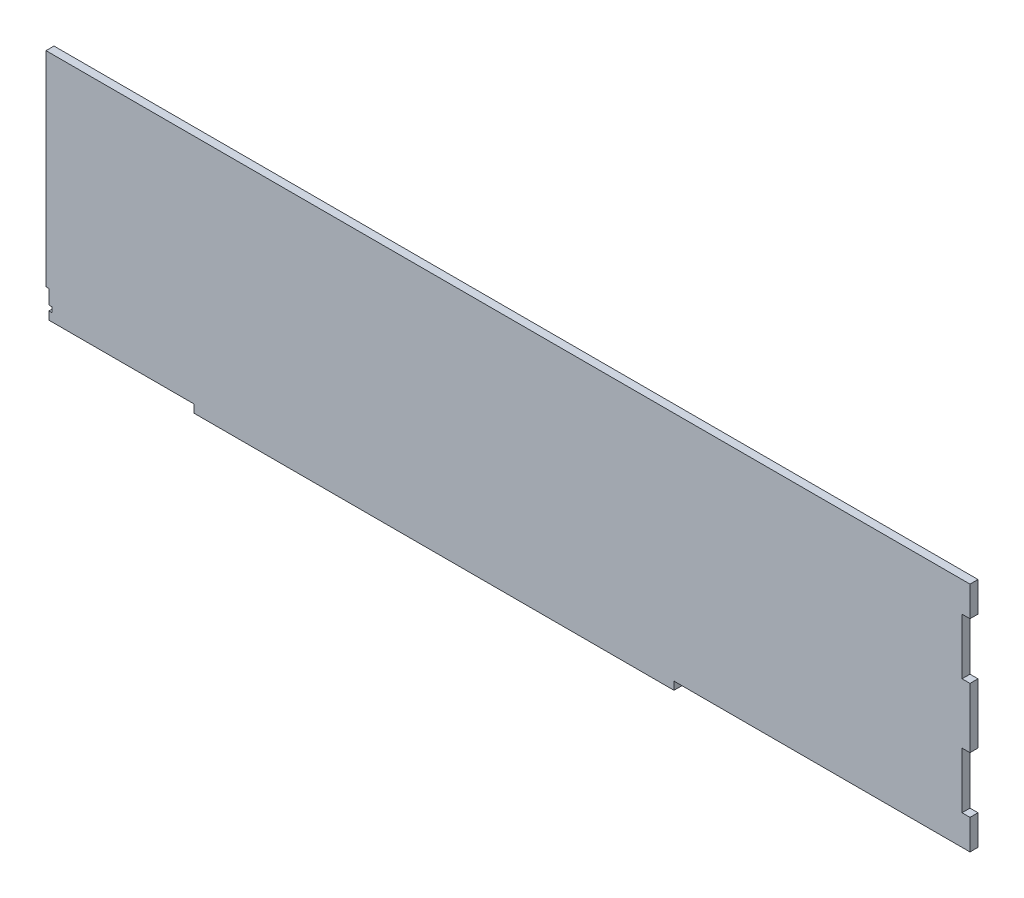
ISO-10303-21;
HEADER;
FILE_DESCRIPTION(('STEP AP214'),'2;1');
FILE_NAME('part.step','',(''),(''),'','','');
FILE_SCHEMA(('AUTOMOTIVE_DESIGN { 1 0 10303 214 1 1 1 1 }'));
ENDSEC;
DATA;
#1=APPLICATION_CONTEXT('core data for automotive mechanical design processes');
#2=APPLICATION_PROTOCOL_DEFINITION('international standard','automotive_design',2000,#1);
#3=PRODUCT_CONTEXT('',#1,'mechanical');
#4=PRODUCT('Part','Part','',(#3));
#5=PRODUCT_RELATED_PRODUCT_CATEGORY('part','',(#4));
#6=PRODUCT_DEFINITION_FORMATION('','',#4);
#7=PRODUCT_DEFINITION_CONTEXT('part definition',#1,'design');
#8=PRODUCT_DEFINITION('design','',#6,#7);
#9=PRODUCT_DEFINITION_SHAPE('','',#8);
#10=(LENGTH_UNIT() NAMED_UNIT(*) SI_UNIT(.MILLI.,.METRE.));
#11=(NAMED_UNIT(*) PLANE_ANGLE_UNIT() SI_UNIT($,.RADIAN.));
#12=(NAMED_UNIT(*) SI_UNIT($,.STERADIAN.) SOLID_ANGLE_UNIT());
#13=UNCERTAINTY_MEASURE_WITH_UNIT(LENGTH_MEASURE(1.E-05),#10,'distance_accuracy_value','');
#14=(GEOMETRIC_REPRESENTATION_CONTEXT(3) GLOBAL_UNCERTAINTY_ASSIGNED_CONTEXT((#13)) GLOBAL_UNIT_ASSIGNED_CONTEXT((#10,
#11,#12)) REPRESENTATION_CONTEXT('',''));
#15=CARTESIAN_POINT('',(0.,0.,0.));
#16=DIRECTION('',(0.,0.,1.));
#17=DIRECTION('',(1.,0.,0.));
#18=AXIS2_PLACEMENT_3D('',#15,#16,#17);
#19=CARTESIAN_POINT('',(1640.,0.,5.));
#20=DIRECTION('',(-1.,0.,0.));
#21=DIRECTION('',(0.,0.,1.));
#22=AXIS2_PLACEMENT_3D('',#19,#20,#21);
#23=PLANE('',#22);
#24=DIRECTION('',(0.,0.,1.));
#25=VECTOR('',#24,1.);
#26=CARTESIAN_POINT('',(1640.,91.25,0.));
#27=LINE('',#26,#25);
#28=CARTESIAN_POINT('',(1640.,91.25,0.));
#29=VERTEX_POINT('',#28);
#30=CARTESIAN_POINT('',(1640.,91.25,5.));
#31=VERTEX_POINT('',#30);
#32=EDGE_CURVE('E309',#29,#31,#27,.T.);
#33=ORIENTED_EDGE('',*,*,#32,.T.);
#34=DIRECTION('',(0.,1.,0.));
#35=VECTOR('',#34,1.);
#36=CARTESIAN_POINT('',(1640.,0.,5.));
#37=LINE('',#36,#35);
#38=CARTESIAN_POINT('',(1640.,53.75,5.));
#39=VERTEX_POINT('',#38);
#40=EDGE_CURVE('E210',#39,#31,#37,.T.);
#41=ORIENTED_EDGE('',*,*,#40,.F.);
#42=DIRECTION('',(0.,0.,1.));
#43=VECTOR('',#42,1.);
#44=CARTESIAN_POINT('',(1640.,53.75,0.));
#45=LINE('',#44,#43);
#46=CARTESIAN_POINT('',(1640.,53.75,0.));
#47=VERTEX_POINT('',#46);
#48=EDGE_CURVE('E337',#47,#39,#45,.T.);
#49=ORIENTED_EDGE('',*,*,#48,.F.);
#50=DIRECTION('',(0.,1.,0.));
#51=VECTOR('',#50,1.);
#52=CARTESIAN_POINT('',(1640.,0.,0.));
#53=LINE('',#52,#51);
#54=EDGE_CURVE('E231',#47,#29,#53,.T.);
#55=ORIENTED_EDGE('',*,*,#54,.T.);
#56=EDGE_LOOP('',(#33,#41,#49,#55));
#57=FACE_BOUND('',#56,.T.);
#58=ADVANCED_FACE('F35',(#57),#23,.F.);
#59=DIRECTION('',(0.,0.,1.));
#60=VECTOR('',#59,1.);
#61=CARTESIAN_POINT('',(1640.,18.75,0.));
#62=LINE('',#61,#60);
#63=CARTESIAN_POINT('',(1640.,18.75,0.));
#64=VERTEX_POINT('',#63);
#65=CARTESIAN_POINT('',(1640.,18.75,5.));
#66=VERTEX_POINT('',#65);
#67=EDGE_CURVE('E217',#64,#66,#62,.T.);
#68=ORIENTED_EDGE('',*,*,#67,.T.);
#69=CARTESIAN_POINT('',(1640.,0.,5.));
#70=VERTEX_POINT('',#69);
#71=EDGE_CURVE('E205',#70,#66,#37,.T.);
#72=ORIENTED_EDGE('',*,*,#71,.F.);
#73=DIRECTION('',(0.,0.,-1.));
#74=VECTOR('',#73,1.);
#75=CARTESIAN_POINT('',(1640.,0.,5.));
#76=LINE('',#75,#74);
#77=CARTESIAN_POINT('',(1640.,0.,0.));
#78=VERTEX_POINT('',#77);
#79=EDGE_CURVE('E207',#70,#78,#76,.T.);
#80=ORIENTED_EDGE('',*,*,#79,.T.);
#81=EDGE_CURVE('E228',#78,#64,#53,.T.);
#82=ORIENTED_EDGE('',*,*,#81,.T.);
#83=EDGE_LOOP('',(#68,#72,#80,#82));
#84=FACE_BOUND('',#83,.T.);
#85=ADVANCED_FACE('F384',(#84),#23,.F.);
#86=CARTESIAN_POINT('',(0.,0.,5.));
#87=DIRECTION('',(0.,0.,1.));
#88=DIRECTION('',(1.,0.,0.));
#89=AXIS2_PLACEMENT_3D('',#86,#87,#88);
#90=PLANE('',#89);
#91=DIRECTION('',(0.,1.,0.));
#92=VECTOR('',#91,1.);
#93=CARTESIAN_POINT('',(1062.5,17.2,5.));
#94=LINE('',#93,#92);
#95=CARTESIAN_POINT('',(1062.5,17.2,5.));
#96=VERTEX_POINT('',#95);
#97=CARTESIAN_POINT('',(1062.5,145.,5.));
#98=VERTEX_POINT('',#97);
#99=EDGE_CURVE('E182',#96,#98,#94,.T.);
#100=ORIENTED_EDGE('',*,*,#99,.F.);
#101=DIRECTION('',(-1.,0.,0.));
#102=VECTOR('',#101,1.);
#103=CARTESIAN_POINT('',(1064.3,17.2,5.));
#104=LINE('',#103,#102);
#105=CARTESIAN_POINT('',(1064.3,17.2,5.));
#106=VERTEX_POINT('',#105);
#107=EDGE_CURVE('E294',#106,#96,#104,.T.);
#108=ORIENTED_EDGE('',*,*,#107,.F.);
#109=DIRECTION('',(0.,1.,0.));
#110=VECTOR('',#109,1.);
#111=CARTESIAN_POINT('',(1064.3,8.2,5.));
#112=LINE('',#111,#110);
#113=CARTESIAN_POINT('',(1064.3,8.2,5.));
#114=VERTEX_POINT('',#113);
#115=EDGE_CURVE('E296',#114,#106,#112,.T.);
#116=ORIENTED_EDGE('',*,*,#115,.F.);
#117=DIRECTION('',(-1.,0.,0.));
#118=VECTOR('',#117,1.);
#119=CARTESIAN_POINT('',(1066.1,8.2,5.));
#120=LINE('',#119,#118);
#121=CARTESIAN_POINT('',(1066.1,8.2,5.));
#122=VERTEX_POINT('',#121);
#123=EDGE_CURVE('E299',#122,#114,#120,.T.);
#124=ORIENTED_EDGE('',*,*,#123,.F.);
#125=DIRECTION('',(0.,1.,0.));
#126=VECTOR('',#125,1.);
#127=CARTESIAN_POINT('',(1066.1,5.,5.));
#128=LINE('',#127,#126);
#129=CARTESIAN_POINT('',(1066.1,5.,5.));
#130=VERTEX_POINT('',#129);
#131=EDGE_CURVE('E288',#130,#122,#128,.T.);
#132=ORIENTED_EDGE('',*,*,#131,.F.);
#133=DIRECTION('',(1.,0.,0.));
#134=VECTOR('',#133,1.);
#135=CARTESIAN_POINT('',(1064.3,5.,5.));
#136=LINE('',#135,#134);
#137=CARTESIAN_POINT('',(1064.3,5.,5.));
#138=VERTEX_POINT('',#137);
#139=EDGE_CURVE('E291',#138,#130,#136,.T.);
#140=ORIENTED_EDGE('',*,*,#139,.F.);
#141=DIRECTION('',(0.,1.,0.));
#142=VECTOR('',#141,1.);
#143=CARTESIAN_POINT('',(1064.3,0.,5.));
#144=LINE('',#143,#142);
#145=CARTESIAN_POINT('',(1064.3,0.,5.));
#146=VERTEX_POINT('',#145);
#147=EDGE_CURVE('E277',#146,#138,#144,.T.);
#148=ORIENTED_EDGE('',*,*,#147,.F.);
#149=DIRECTION('',(1.,0.,0.));
#150=VECTOR('',#149,1.);
#151=CARTESIAN_POINT('',(0.,0.,5.));
#152=LINE('',#151,#150);
#153=CARTESIAN_POINT('',(1155.,0.,5.));
#154=VERTEX_POINT('',#153);
#155=EDGE_CURVE('E232',#146,#154,#152,.T.);
#156=ORIENTED_EDGE('',*,*,#155,.T.);
#157=DIRECTION('',(0.,-1.,0.));
#158=VECTOR('',#157,1.);
#159=CARTESIAN_POINT('',(1155.,0.,5.));
#160=LINE('',#159,#158);
#161=CARTESIAN_POINT('',(1155.,-5.,5.));
#162=VERTEX_POINT('',#161);
#163=EDGE_CURVE('E353',#154,#162,#160,.T.);
#164=ORIENTED_EDGE('',*,*,#163,.T.);
#165=DIRECTION('',(1.,0.,0.));
#166=VECTOR('',#165,1.);
#167=CARTESIAN_POINT('',(0.,-5.,5.));
#168=LINE('',#167,#166);
#169=CARTESIAN_POINT('',(1455.,-5.,5.));
#170=VERTEX_POINT('',#169);
#171=EDGE_CURVE('E355',#162,#170,#168,.T.);
#172=ORIENTED_EDGE('',*,*,#171,.T.);
#173=DIRECTION('',(0.,-1.,0.));
#174=VECTOR('',#173,1.);
#175=CARTESIAN_POINT('',(1455.,0.,5.));
#176=LINE('',#175,#174);
#177=CARTESIAN_POINT('',(1455.,0.,5.));
#178=VERTEX_POINT('',#177);
#179=EDGE_CURVE('E357',#178,#170,#176,.T.);
#180=ORIENTED_EDGE('',*,*,#179,.F.);
#181=DIRECTION('',(1.,0.,0.));
#182=VECTOR('',#181,1.);
#183=CARTESIAN_POINT('',(0.,0.,5.));
#184=LINE('',#183,#182);
#185=EDGE_CURVE('E359',#178,#70,#184,.T.);
#186=ORIENTED_EDGE('',*,*,#185,.T.);
#187=ORIENTED_EDGE('',*,*,#71,.T.);
#188=DIRECTION('',(-1.,0.,0.));
#189=VECTOR('',#188,1.);
#190=CARTESIAN_POINT('',(1640.,18.75,5.));
#191=LINE('',#190,#189);
#192=CARTESIAN_POINT('',(1635.,18.75,5.));
#193=VERTEX_POINT('',#192);
#194=EDGE_CURVE('E332',#66,#193,#191,.T.);
#195=ORIENTED_EDGE('',*,*,#194,.T.);
#196=DIRECTION('',(0.,1.,0.));
#197=VECTOR('',#196,1.);
#198=CARTESIAN_POINT('',(1635.,18.75,5.));
#199=LINE('',#198,#197);
#200=CARTESIAN_POINT('',(1635.,53.75,5.));
#201=VERTEX_POINT('',#200);
#202=EDGE_CURVE('E340',#193,#201,#199,.T.);
#203=ORIENTED_EDGE('',*,*,#202,.T.);
#204=DIRECTION('',(-1.,0.,0.));
#205=VECTOR('',#204,1.);
#206=CARTESIAN_POINT('',(1640.,53.75,5.));
#207=LINE('',#206,#205);
#208=EDGE_CURVE('E323',#39,#201,#207,.T.);
#209=ORIENTED_EDGE('',*,*,#208,.F.);
#210=ORIENTED_EDGE('',*,*,#40,.T.);
#211=DIRECTION('',(-1.,0.,0.));
#212=VECTOR('',#211,1.);
#213=CARTESIAN_POINT('',(1640.,91.25,5.));
#214=LINE('',#213,#212);
#215=CARTESIAN_POINT('',(1635.,91.25,5.));
#216=VERTEX_POINT('',#215);
#217=EDGE_CURVE('E320',#31,#216,#214,.T.);
#218=ORIENTED_EDGE('',*,*,#217,.T.);
#219=DIRECTION('',(0.,-1.,0.));
#220=VECTOR('',#219,1.);
#221=CARTESIAN_POINT('',(1635.,126.25,5.));
#222=LINE('',#221,#220);
#223=CARTESIAN_POINT('',(1635.,126.25,5.));
#224=VERTEX_POINT('',#223);
#225=EDGE_CURVE('E316',#224,#216,#222,.T.);
#226=ORIENTED_EDGE('',*,*,#225,.F.);
#227=DIRECTION('',(-1.,0.,0.));
#228=VECTOR('',#227,1.);
#229=CARTESIAN_POINT('',(1640.,126.25,5.));
#230=LINE('',#229,#228);
#231=CARTESIAN_POINT('',(1640.,126.25,5.));
#232=VERTEX_POINT('',#231);
#233=EDGE_CURVE('E313',#232,#224,#230,.T.);
#234=ORIENTED_EDGE('',*,*,#233,.F.);
#235=CARTESIAN_POINT('',(1640.,145.,5.));
#236=VERTEX_POINT('',#235);
#237=EDGE_CURVE('E202',#232,#236,#37,.T.);
#238=ORIENTED_EDGE('',*,*,#237,.T.);
#239=DIRECTION('',(1.,0.,0.));
#240=VECTOR('',#239,1.);
#241=CARTESIAN_POINT('',(0.,145.,5.));
#242=LINE('',#241,#240);
#243=EDGE_CURVE('E195',#98,#236,#242,.T.);
#244=ORIENTED_EDGE('',*,*,#243,.F.);
#245=EDGE_LOOP('',(#100,#108,#116,#124,#132,#140,#148,#156,#164,#172,#180,#186,#187,#195,#203,
#209,#210,#218,#226,#234,#238,#244));
#246=FACE_BOUND('',#245,.T.);
#247=ADVANCED_FACE('F199',(#246),#90,.T.);
#248=CARTESIAN_POINT('',(0.,0.,0.));
#249=DIRECTION('',(0.,0.,1.));
#250=DIRECTION('',(1.,0.,0.));
#251=AXIS2_PLACEMENT_3D('',#248,#249,#250);
#252=PLANE('',#251);
#253=DIRECTION('',(-1.,0.,0.));
#254=VECTOR('',#253,1.);
#255=CARTESIAN_POINT('',(0.,17.2,0.));
#256=LINE('',#255,#254);
#257=CARTESIAN_POINT('',(1064.3,17.2,0.));
#258=VERTEX_POINT('',#257);
#259=CARTESIAN_POINT('',(1062.5,17.2,0.));
#260=VERTEX_POINT('',#259);
#261=EDGE_CURVE('E252',#258,#260,#256,.T.);
#262=ORIENTED_EDGE('',*,*,#261,.T.);
#263=DIRECTION('',(0.,1.,0.));
#264=VECTOR('',#263,1.);
#265=CARTESIAN_POINT('',(1062.5,0.,0.));
#266=LINE('',#265,#264);
#267=CARTESIAN_POINT('',(1062.5,145.,0.));
#268=VERTEX_POINT('',#267);
#269=EDGE_CURVE('E50',#260,#268,#266,.T.);
#270=ORIENTED_EDGE('',*,*,#269,.T.);
#271=DIRECTION('',(1.,0.,0.));
#272=VECTOR('',#271,1.);
#273=CARTESIAN_POINT('',(0.,145.,0.));
#274=LINE('',#273,#272);
#275=CARTESIAN_POINT('',(1640.,145.,0.));
#276=VERTEX_POINT('',#275);
#277=EDGE_CURVE('E197',#268,#276,#274,.T.);
#278=ORIENTED_EDGE('',*,*,#277,.T.);
#279=CARTESIAN_POINT('',(1640.,126.25,0.));
#280=VERTEX_POINT('',#279);
#281=EDGE_CURVE('E227',#280,#276,#53,.T.);
#282=ORIENTED_EDGE('',*,*,#281,.F.);
#283=DIRECTION('',(-1.,0.,0.));
#284=VECTOR('',#283,1.);
#285=CARTESIAN_POINT('',(1640.,126.25,0.));
#286=LINE('',#285,#284);
#287=CARTESIAN_POINT('',(1635.,126.25,0.));
#288=VERTEX_POINT('',#287);
#289=EDGE_CURVE('E312',#280,#288,#286,.T.);
#290=ORIENTED_EDGE('',*,*,#289,.T.);
#291=DIRECTION('',(0.,-1.,0.));
#292=VECTOR('',#291,1.);
#293=CARTESIAN_POINT('',(1635.,126.25,0.));
#294=LINE('',#293,#292);
#295=CARTESIAN_POINT('',(1635.,91.25,0.));
#296=VERTEX_POINT('',#295);
#297=EDGE_CURVE('E57',#288,#296,#294,.T.);
#298=ORIENTED_EDGE('',*,*,#297,.T.);
#299=DIRECTION('',(-1.,0.,0.));
#300=VECTOR('',#299,1.);
#301=CARTESIAN_POINT('',(1640.,91.25,0.));
#302=LINE('',#301,#300);
#303=EDGE_CURVE('E317',#29,#296,#302,.T.);
#304=ORIENTED_EDGE('',*,*,#303,.F.);
#305=ORIENTED_EDGE('',*,*,#54,.F.);
#306=DIRECTION('',(-1.,0.,0.));
#307=VECTOR('',#306,1.);
#308=CARTESIAN_POINT('',(1640.,53.75,0.));
#309=LINE('',#308,#307);
#310=CARTESIAN_POINT('',(1635.,53.75,0.));
#311=VERTEX_POINT('',#310);
#312=EDGE_CURVE('E328',#47,#311,#309,.T.);
#313=ORIENTED_EDGE('',*,*,#312,.T.);
#314=DIRECTION('',(0.,1.,0.));
#315=VECTOR('',#314,1.);
#316=CARTESIAN_POINT('',(1635.,18.75,0.));
#317=LINE('',#316,#315);
#318=CARTESIAN_POINT('',(1635.,18.75,0.));
#319=VERTEX_POINT('',#318);
#320=EDGE_CURVE('E331',#319,#311,#317,.T.);
#321=ORIENTED_EDGE('',*,*,#320,.F.);
#322=DIRECTION('',(-1.,0.,0.));
#323=VECTOR('',#322,1.);
#324=CARTESIAN_POINT('',(1640.,18.75,0.));
#325=LINE('',#324,#323);
#326=EDGE_CURVE('E335',#64,#319,#325,.T.);
#327=ORIENTED_EDGE('',*,*,#326,.F.);
#328=ORIENTED_EDGE('',*,*,#81,.F.);
#329=DIRECTION('',(1.,0.,0.));
#330=VECTOR('',#329,1.);
#331=CARTESIAN_POINT('',(0.,0.,0.));
#332=LINE('',#331,#330);
#333=CARTESIAN_POINT('',(1455.,0.,0.));
#334=VERTEX_POINT('',#333);
#335=EDGE_CURVE('E225',#334,#78,#332,.T.);
#336=ORIENTED_EDGE('',*,*,#335,.F.);
#337=DIRECTION('',(0.,-1.,0.));
#338=VECTOR('',#337,1.);
#339=CARTESIAN_POINT('',(1455.,0.,0.));
#340=LINE('',#339,#338);
#341=CARTESIAN_POINT('',(1455.,-5.,0.));
#342=VERTEX_POINT('',#341);
#343=EDGE_CURVE('E222',#334,#342,#340,.T.);
#344=ORIENTED_EDGE('',*,*,#343,.T.);
#345=DIRECTION('',(1.,0.,0.));
#346=VECTOR('',#345,1.);
#347=CARTESIAN_POINT('',(0.,-5.,0.));
#348=LINE('',#347,#346);
#349=CARTESIAN_POINT('',(1155.,-5.,0.));
#350=VERTEX_POINT('',#349);
#351=EDGE_CURVE('E219',#350,#342,#348,.T.);
#352=ORIENTED_EDGE('',*,*,#351,.F.);
#353=DIRECTION('',(0.,-1.,0.));
#354=VECTOR('',#353,1.);
#355=CARTESIAN_POINT('',(1155.,0.,0.));
#356=LINE('',#355,#354);
#357=CARTESIAN_POINT('',(1155.,0.,0.));
#358=VERTEX_POINT('',#357);
#359=EDGE_CURVE('E216',#358,#350,#356,.T.);
#360=ORIENTED_EDGE('',*,*,#359,.F.);
#361=DIRECTION('',(1.,0.,0.));
#362=VECTOR('',#361,1.);
#363=CARTESIAN_POINT('',(0.,0.,0.));
#364=LINE('',#363,#362);
#365=CARTESIAN_POINT('',(1064.3,0.,0.));
#366=VERTEX_POINT('',#365);
#367=EDGE_CURVE('E214',#366,#358,#364,.T.);
#368=ORIENTED_EDGE('',*,*,#367,.F.);
#369=DIRECTION('',(0.,1.,0.));
#370=VECTOR('',#369,1.);
#371=CARTESIAN_POINT('',(1064.3,0.,0.));
#372=LINE('',#371,#370);
#373=CARTESIAN_POINT('',(1064.3,5.,0.));
#374=VERTEX_POINT('',#373);
#375=EDGE_CURVE('E265',#366,#374,#372,.T.);
#376=ORIENTED_EDGE('',*,*,#375,.T.);
#377=DIRECTION('',(1.,0.,0.));
#378=VECTOR('',#377,1.);
#379=CARTESIAN_POINT('',(0.,4.99999999999949,0.));
#380=LINE('',#379,#378);
#381=CARTESIAN_POINT('',(1066.1,5.,0.));
#382=VERTEX_POINT('',#381);
#383=EDGE_CURVE('E43',#374,#382,#380,.T.);
#384=ORIENTED_EDGE('',*,*,#383,.T.);
#385=DIRECTION('',(0.,1.,0.));
#386=VECTOR('',#385,1.);
#387=CARTESIAN_POINT('',(1066.1,0.,0.));
#388=LINE('',#387,#386);
#389=CARTESIAN_POINT('',(1066.1,8.2,0.));
#390=VERTEX_POINT('',#389);
#391=EDGE_CURVE('E258',#382,#390,#388,.T.);
#392=ORIENTED_EDGE('',*,*,#391,.T.);
#393=DIRECTION('',(-1.,0.,0.));
#394=VECTOR('',#393,1.);
#395=CARTESIAN_POINT('',(0.,8.2,0.));
#396=LINE('',#395,#394);
#397=CARTESIAN_POINT('',(1064.3,8.2,0.));
#398=VERTEX_POINT('',#397);
#399=EDGE_CURVE('E255',#390,#398,#396,.T.);
#400=ORIENTED_EDGE('',*,*,#399,.T.);
#401=DIRECTION('',(0.,1.,0.));
#402=VECTOR('',#401,1.);
#403=CARTESIAN_POINT('',(1064.3,0.,0.));
#404=LINE('',#403,#402);
#405=EDGE_CURVE('E249',#398,#258,#404,.T.);
#406=ORIENTED_EDGE('',*,*,#405,.T.);
#407=EDGE_LOOP('',(#262,#270,#278,#282,#290,#298,#304,#305,#313,#321,#327,#328,#336,#344,#352,
#360,#368,#376,#384,#392,#400,#406));
#408=FACE_BOUND('',#407,.T.);
#409=ADVANCED_FACE('F263',(#408),#252,.F.);
#410=CARTESIAN_POINT('',(0.,0.,5.));
#411=DIRECTION('',(0.,1.,0.));
#412=DIRECTION('',(0.,0.,1.));
#413=AXIS2_PLACEMENT_3D('',#410,#411,#412);
#414=PLANE('',#413);
#415=ORIENTED_EDGE('',*,*,#155,.F.);
#416=DIRECTION('',(0.,0.,-1.));
#417=VECTOR('',#416,1.);
#418=CARTESIAN_POINT('',(1064.3,0.,5.));
#419=LINE('',#418,#417);
#420=EDGE_CURVE('E246',#146,#366,#419,.T.);
#421=ORIENTED_EDGE('',*,*,#420,.T.);
#422=ORIENTED_EDGE('',*,*,#367,.T.);
#423=DIRECTION('',(0.,0.,-1.));
#424=VECTOR('',#423,1.);
#425=CARTESIAN_POINT('',(1155.,0.,5.));
#426=LINE('',#425,#424);
#427=EDGE_CURVE('E243',#154,#358,#426,.T.);
#428=ORIENTED_EDGE('',*,*,#427,.F.);
#429=EDGE_LOOP('',(#415,#421,#422,#428));
#430=FACE_BOUND('',#429,.T.);
#431=ADVANCED_FACE('F37',(#430),#414,.F.);
#432=CARTESIAN_POINT('',(1155.,0.,5.));
#433=DIRECTION('',(1.,0.,0.));
#434=DIRECTION('',(0.,0.,-1.));
#435=AXIS2_PLACEMENT_3D('',#432,#433,#434);
#436=PLANE('',#435);
#437=ORIENTED_EDGE('',*,*,#359,.T.);
#438=DIRECTION('',(0.,0.,-1.));
#439=VECTOR('',#438,1.);
#440=CARTESIAN_POINT('',(1155.,-5.,5.));
#441=LINE('',#440,#439);
#442=EDGE_CURVE('E240',#162,#350,#441,.T.);
#443=ORIENTED_EDGE('',*,*,#442,.F.);
#444=ORIENTED_EDGE('',*,*,#163,.F.);
#445=ORIENTED_EDGE('',*,*,#427,.T.);
#446=EDGE_LOOP('',(#437,#443,#444,#445));
#447=FACE_BOUND('',#446,.T.);
#448=ADVANCED_FACE('F423',(#447),#436,.F.);
#449=CARTESIAN_POINT('',(0.,-5.,5.));
#450=DIRECTION('',(0.,1.,0.));
#451=DIRECTION('',(0.,0.,1.));
#452=AXIS2_PLACEMENT_3D('',#449,#450,#451);
#453=PLANE('',#452);
#454=ORIENTED_EDGE('',*,*,#351,.T.);
#455=DIRECTION('',(0.,0.,-1.));
#456=VECTOR('',#455,1.);
#457=CARTESIAN_POINT('',(1455.,-5.,5.));
#458=LINE('',#457,#456);
#459=EDGE_CURVE('E238',#170,#342,#458,.T.);
#460=ORIENTED_EDGE('',*,*,#459,.F.);
#461=ORIENTED_EDGE('',*,*,#171,.F.);
#462=ORIENTED_EDGE('',*,*,#442,.T.);
#463=EDGE_LOOP('',(#454,#460,#461,#462));
#464=FACE_BOUND('',#463,.T.);
#465=ADVANCED_FACE('F419',(#464),#453,.F.);
#466=CARTESIAN_POINT('',(1455.,0.,5.));
#467=DIRECTION('',(1.,0.,0.));
#468=DIRECTION('',(0.,0.,-1.));
#469=AXIS2_PLACEMENT_3D('',#466,#467,#468);
#470=PLANE('',#469);
#471=ORIENTED_EDGE('',*,*,#343,.F.);
#472=DIRECTION('',(0.,0.,-1.));
#473=VECTOR('',#472,1.);
#474=CARTESIAN_POINT('',(1455.,0.,5.));
#475=LINE('',#474,#473);
#476=EDGE_CURVE('E236',#178,#334,#475,.T.);
#477=ORIENTED_EDGE('',*,*,#476,.F.);
#478=ORIENTED_EDGE('',*,*,#179,.T.);
#479=ORIENTED_EDGE('',*,*,#459,.T.);
#480=EDGE_LOOP('',(#471,#477,#478,#479));
#481=FACE_BOUND('',#480,.T.);
#482=ADVANCED_FACE('F391',(#481),#470,.T.);
#483=CARTESIAN_POINT('',(0.,0.,5.));
#484=DIRECTION('',(0.,1.,0.));
#485=DIRECTION('',(0.,0.,1.));
#486=AXIS2_PLACEMENT_3D('',#483,#484,#485);
#487=PLANE('',#486);
#488=ORIENTED_EDGE('',*,*,#335,.T.);
#489=ORIENTED_EDGE('',*,*,#79,.F.);
#490=ORIENTED_EDGE('',*,*,#185,.F.);
#491=ORIENTED_EDGE('',*,*,#476,.T.);
#492=EDGE_LOOP('',(#488,#489,#490,#491));
#493=FACE_BOUND('',#492,.T.);
#494=ADVANCED_FACE('F382',(#493),#487,.F.);
#495=ORIENTED_EDGE('',*,*,#237,.F.);
#496=DIRECTION('',(0.,0.,1.));
#497=VECTOR('',#496,1.);
#498=CARTESIAN_POINT('',(1640.,126.25,0.));
#499=LINE('',#498,#497);
#500=EDGE_CURVE('E307',#280,#232,#499,.T.);
#501=ORIENTED_EDGE('',*,*,#500,.F.);
#502=ORIENTED_EDGE('',*,*,#281,.T.);
#503=DIRECTION('',(0.,0.,-1.));
#504=VECTOR('',#503,1.);
#505=CARTESIAN_POINT('',(1640.,145.,5.));
#506=LINE('',#505,#504);
#507=EDGE_CURVE('E204',#236,#276,#506,.T.);
#508=ORIENTED_EDGE('',*,*,#507,.F.);
#509=EDGE_LOOP('',(#495,#501,#502,#508));
#510=FACE_BOUND('',#509,.T.);
#511=ADVANCED_FACE('F380',(#510),#23,.F.);
#512=CARTESIAN_POINT('',(0.,145.,5.));
#513=DIRECTION('',(0.,1.,0.));
#514=DIRECTION('',(0.,0.,1.));
#515=AXIS2_PLACEMENT_3D('',#512,#513,#514);
#516=PLANE('',#515);
#517=DIRECTION('',(0.,0.,1.));
#518=VECTOR('',#517,1.);
#519=CARTESIAN_POINT('',(1062.5,145.,-5.));
#520=LINE('',#519,#518);
#521=EDGE_CURVE('E185',#268,#98,#520,.T.);
#522=ORIENTED_EDGE('',*,*,#521,.T.);
#523=ORIENTED_EDGE('',*,*,#243,.T.);
#524=ORIENTED_EDGE('',*,*,#507,.T.);
#525=ORIENTED_EDGE('',*,*,#277,.F.);
#526=EDGE_LOOP('',(#522,#523,#524,#525));
#527=FACE_BOUND('',#526,.T.);
#528=ADVANCED_FACE('F193',(#527),#516,.T.);
#529=CARTESIAN_POINT('',(1640.,18.75,0.));
#530=DIRECTION('',(0.,1.,0.));
#531=DIRECTION('',(0.,0.,1.));
#532=AXIS2_PLACEMENT_3D('',#529,#530,#531);
#533=PLANE('',#532);
#534=ORIENTED_EDGE('',*,*,#194,.F.);
#535=ORIENTED_EDGE('',*,*,#67,.F.);
#536=ORIENTED_EDGE('',*,*,#326,.T.);
#537=DIRECTION('',(0.,0.,1.));
#538=VECTOR('',#537,1.);
#539=CARTESIAN_POINT('',(1635.,18.75,0.));
#540=LINE('',#539,#538);
#541=EDGE_CURVE('E347',#319,#193,#540,.T.);
#542=ORIENTED_EDGE('',*,*,#541,.T.);
#543=EDGE_LOOP('',(#534,#535,#536,#542));
#544=FACE_BOUND('',#543,.T.);
#545=ADVANCED_FACE('F389',(#544),#533,.T.);
#546=CARTESIAN_POINT('',(1635.,18.75,0.));
#547=DIRECTION('',(1.,0.,0.));
#548=DIRECTION('',(0.,0.,-1.));
#549=AXIS2_PLACEMENT_3D('',#546,#547,#548);
#550=PLANE('',#549);
#551=ORIENTED_EDGE('',*,*,#202,.F.);
#552=ORIENTED_EDGE('',*,*,#541,.F.);
#553=ORIENTED_EDGE('',*,*,#320,.T.);
#554=DIRECTION('',(0.,0.,1.));
#555=VECTOR('',#554,1.);
#556=CARTESIAN_POINT('',(1635.,53.75,0.));
#557=LINE('',#556,#555);
#558=EDGE_CURVE('E349',#311,#201,#557,.T.);
#559=ORIENTED_EDGE('',*,*,#558,.T.);
#560=EDGE_LOOP('',(#551,#552,#553,#559));
#561=FACE_BOUND('',#560,.T.);
#562=ADVANCED_FACE('F409',(#561),#550,.T.);
#563=CARTESIAN_POINT('',(1640.,53.75,0.));
#564=DIRECTION('',(0.,1.,0.));
#565=DIRECTION('',(0.,0.,1.));
#566=AXIS2_PLACEMENT_3D('',#563,#564,#565);
#567=PLANE('',#566);
#568=ORIENTED_EDGE('',*,*,#208,.T.);
#569=ORIENTED_EDGE('',*,*,#558,.F.);
#570=ORIENTED_EDGE('',*,*,#312,.F.);
#571=ORIENTED_EDGE('',*,*,#48,.T.);
#572=EDGE_LOOP('',(#568,#569,#570,#571));
#573=FACE_BOUND('',#572,.T.);
#574=ADVANCED_FACE('F411',(#573),#567,.F.);
#575=CARTESIAN_POINT('',(1640.,91.25,0.));
#576=DIRECTION('',(0.,1.,0.));
#577=DIRECTION('',(0.,0.,1.));
#578=AXIS2_PLACEMENT_3D('',#575,#576,#577);
#579=PLANE('',#578);
#580=ORIENTED_EDGE('',*,*,#217,.F.);
#581=ORIENTED_EDGE('',*,*,#32,.F.);
#582=ORIENTED_EDGE('',*,*,#303,.T.);
#583=DIRECTION('',(0.,0.,1.));
#584=VECTOR('',#583,1.);
#585=CARTESIAN_POINT('',(1635.,91.25,0.));
#586=LINE('',#585,#584);
#587=EDGE_CURVE('E303',#296,#216,#586,.T.);
#588=ORIENTED_EDGE('',*,*,#587,.T.);
#589=EDGE_LOOP('',(#580,#581,#582,#588));
#590=FACE_BOUND('',#589,.T.);
#591=ADVANCED_FACE('F373',(#590),#579,.T.);
#592=CARTESIAN_POINT('',(1635.,126.25,0.));
#593=DIRECTION('',(-1.,0.,0.));
#594=DIRECTION('',(0.,0.,1.));
#595=AXIS2_PLACEMENT_3D('',#592,#593,#594);
#596=PLANE('',#595);
#597=ORIENTED_EDGE('',*,*,#225,.T.);
#598=ORIENTED_EDGE('',*,*,#587,.F.);
#599=ORIENTED_EDGE('',*,*,#297,.F.);
#600=DIRECTION('',(0.,0.,1.));
#601=VECTOR('',#600,1.);
#602=CARTESIAN_POINT('',(1635.,126.25,0.));
#603=LINE('',#602,#601);
#604=EDGE_CURVE('E305',#288,#224,#603,.T.);
#605=ORIENTED_EDGE('',*,*,#604,.T.);
#606=EDGE_LOOP('',(#597,#598,#599,#605));
#607=FACE_BOUND('',#606,.T.);
#608=ADVANCED_FACE('F458',(#607),#596,.F.);
#609=CARTESIAN_POINT('',(1640.,126.25,0.));
#610=DIRECTION('',(0.,1.,0.));
#611=DIRECTION('',(0.,0.,1.));
#612=AXIS2_PLACEMENT_3D('',#609,#610,#611);
#613=PLANE('',#612);
#614=ORIENTED_EDGE('',*,*,#233,.T.);
#615=ORIENTED_EDGE('',*,*,#604,.F.);
#616=ORIENTED_EDGE('',*,*,#289,.F.);
#617=ORIENTED_EDGE('',*,*,#500,.T.);
#618=EDGE_LOOP('',(#614,#615,#616,#617));
#619=FACE_BOUND('',#618,.T.);
#620=ADVANCED_FACE('F378',(#619),#613,.F.);
#621=CARTESIAN_POINT('',(1066.1,8.2,-5.));
#622=DIRECTION('',(0.,1.,0.));
#623=DIRECTION('',(0.,0.,1.));
#624=AXIS2_PLACEMENT_3D('',#621,#622,#623);
#625=PLANE('',#624);
#626=DIRECTION('',(0.,0.,1.));
#627=VECTOR('',#626,1.);
#628=CARTESIAN_POINT('',(1066.1,8.2,-5.));
#629=LINE('',#628,#627);
#630=EDGE_CURVE('E283',#390,#122,#629,.T.);
#631=ORIENTED_EDGE('',*,*,#630,.T.);
#632=ORIENTED_EDGE('',*,*,#123,.T.);
#633=DIRECTION('',(0.,0.,1.));
#634=VECTOR('',#633,1.);
#635=CARTESIAN_POINT('',(1064.3,8.2,-5.));
#636=LINE('',#635,#634);
#637=EDGE_CURVE('E281',#398,#114,#636,.T.);
#638=ORIENTED_EDGE('',*,*,#637,.F.);
#639=ORIENTED_EDGE('',*,*,#399,.F.);
#640=EDGE_LOOP('',(#631,#632,#638,#639));
#641=FACE_BOUND('',#640,.T.);
#642=ADVANCED_FACE('F435',(#641),#625,.F.);
#643=CARTESIAN_POINT('',(1066.1,5.,-5.));
#644=DIRECTION('',(1.,0.,0.));
#645=DIRECTION('',(0.,0.,-1.));
#646=AXIS2_PLACEMENT_3D('',#643,#644,#645);
#647=PLANE('',#646);
#648=DIRECTION('',(0.,0.,1.));
#649=VECTOR('',#648,1.);
#650=CARTESIAN_POINT('',(1066.1,5.,-5.));
#651=LINE('',#650,#649);
#652=EDGE_CURVE('E273',#382,#130,#651,.T.);
#653=ORIENTED_EDGE('',*,*,#652,.T.);
#654=ORIENTED_EDGE('',*,*,#131,.T.);
#655=ORIENTED_EDGE('',*,*,#630,.F.);
#656=ORIENTED_EDGE('',*,*,#391,.F.);
#657=EDGE_LOOP('',(#653,#654,#655,#656));
#658=FACE_BOUND('',#657,.T.);
#659=ADVANCED_FACE('F433',(#658),#647,.F.);
#660=CARTESIAN_POINT('',(1064.3,5.,-5.));
#661=DIRECTION('',(0.,-1.,0.));
#662=DIRECTION('',(1.,0.,0.));
#663=AXIS2_PLACEMENT_3D('',#660,#661,#662);
#664=PLANE('',#663);
#665=DIRECTION('',(0.,0.,1.));
#666=VECTOR('',#665,1.);
#667=CARTESIAN_POINT('',(1064.3,5.,-5.));
#668=LINE('',#667,#666);
#669=EDGE_CURVE('E271',#374,#138,#668,.T.);
#670=ORIENTED_EDGE('',*,*,#669,.T.);
#671=ORIENTED_EDGE('',*,*,#139,.T.);
#672=ORIENTED_EDGE('',*,*,#652,.F.);
#673=ORIENTED_EDGE('',*,*,#383,.F.);
#674=EDGE_LOOP('',(#670,#671,#672,#673));
#675=FACE_BOUND('',#674,.T.);
#676=ADVANCED_FACE('F269',(#675),#664,.F.);
#677=CARTESIAN_POINT('',(1064.3,17.2,-5.));
#678=DIRECTION('',(0.,1.,0.));
#679=DIRECTION('',(0.,0.,1.));
#680=AXIS2_PLACEMENT_3D('',#677,#678,#679);
#681=PLANE('',#680);
#682=ORIENTED_EDGE('',*,*,#107,.T.);
#683=DIRECTION('',(0.,0.,-1.));
#684=VECTOR('',#683,1.);
#685=CARTESIAN_POINT('',(1062.5,17.2,-5.));
#686=LINE('',#685,#684);
#687=EDGE_CURVE('E11',#96,#260,#686,.T.);
#688=ORIENTED_EDGE('',*,*,#687,.T.);
#689=ORIENTED_EDGE('',*,*,#261,.F.);
#690=DIRECTION('',(0.,0.,1.));
#691=VECTOR('',#690,1.);
#692=CARTESIAN_POINT('',(1064.3,17.2,-5.));
#693=LINE('',#692,#691);
#694=EDGE_CURVE('E279',#258,#106,#693,.T.);
#695=ORIENTED_EDGE('',*,*,#694,.T.);
#696=EDGE_LOOP('',(#682,#688,#689,#695));
#697=FACE_BOUND('',#696,.T.);
#698=ADVANCED_FACE('F441',(#697),#681,.F.);
#699=CARTESIAN_POINT('',(1064.3,8.2,-5.));
#700=DIRECTION('',(1.,0.,0.));
#701=DIRECTION('',(0.,0.,-1.));
#702=AXIS2_PLACEMENT_3D('',#699,#700,#701);
#703=PLANE('',#702);
#704=ORIENTED_EDGE('',*,*,#637,.T.);
#705=ORIENTED_EDGE('',*,*,#115,.T.);
#706=ORIENTED_EDGE('',*,*,#694,.F.);
#707=ORIENTED_EDGE('',*,*,#405,.F.);
#708=EDGE_LOOP('',(#704,#705,#706,#707));
#709=FACE_BOUND('',#708,.T.);
#710=ADVANCED_FACE('F439',(#709),#703,.F.);
#711=CARTESIAN_POINT('',(1064.3,0.,-5.));
#712=DIRECTION('',(1.,0.,0.));
#713=DIRECTION('',(0.,0.,-1.));
#714=AXIS2_PLACEMENT_3D('',#711,#712,#713);
#715=PLANE('',#714);
#716=ORIENTED_EDGE('',*,*,#420,.F.);
#717=ORIENTED_EDGE('',*,*,#147,.T.);
#718=ORIENTED_EDGE('',*,*,#669,.F.);
#719=ORIENTED_EDGE('',*,*,#375,.F.);
#720=EDGE_LOOP('',(#716,#717,#718,#719));
#721=FACE_BOUND('',#720,.T.);
#722=ADVANCED_FACE('F275',(#721),#715,.F.);
#723=CARTESIAN_POINT('',(1062.5,17.2,-5.));
#724=DIRECTION('',(1.,0.,0.));
#725=DIRECTION('',(0.,0.,-1.));
#726=AXIS2_PLACEMENT_3D('',#723,#724,#725);
#727=PLANE('',#726);
#728=ORIENTED_EDGE('',*,*,#687,.F.);
#729=ORIENTED_EDGE('',*,*,#99,.T.);
#730=ORIENTED_EDGE('',*,*,#521,.F.);
#731=ORIENTED_EDGE('',*,*,#269,.F.);
#732=EDGE_LOOP('',(#728,#729,#730,#731));
#733=FACE_BOUND('',#732,.T.);
#734=ADVANCED_FACE('F184',(#733),#727,.F.);
#735=CLOSED_SHELL('',(#58,#85,#247,#409,#431,#448,#465,#482,#494,#511,#528,#545,#562,#574,#591,
#608,#620,#642,#659,#676,#698,#710,#722,#734));
#736=MANIFOLD_SOLID_BREP('B2',#735);
#737=ADVANCED_BREP_SHAPE_REPRESENTATION('',(#18,#736),#14);
#738=SHAPE_DEFINITION_REPRESENTATION(#9,#737);
ENDSEC;
END-ISO-10303-21;
